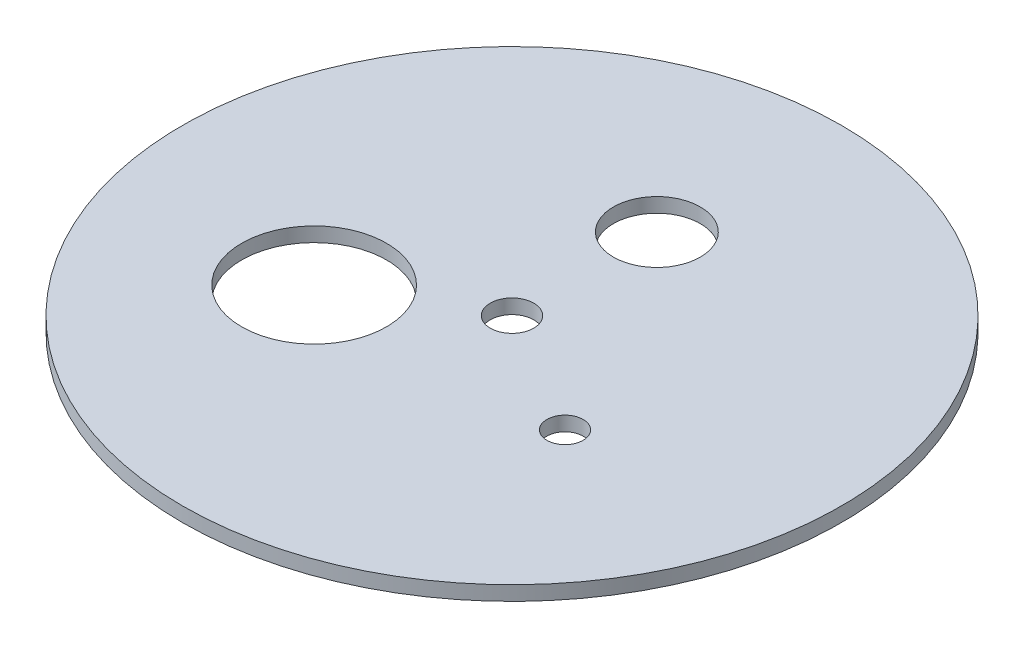
ISO-10303-21;
HEADER;
FILE_DESCRIPTION(('STEP AP214'),'2;1');
FILE_NAME('part.step','',(''),(''),'','','');
FILE_SCHEMA(('AUTOMOTIVE_DESIGN { 1 0 10303 214 1 1 1 1 }'));
ENDSEC;
DATA;
#1=APPLICATION_CONTEXT('core data for automotive mechanical design processes');
#2=APPLICATION_PROTOCOL_DEFINITION('international standard','automotive_design',2000,#1);
#3=PRODUCT_CONTEXT('',#1,'mechanical');
#4=PRODUCT('Part','Part','',(#3));
#5=PRODUCT_RELATED_PRODUCT_CATEGORY('part','',(#4));
#6=PRODUCT_DEFINITION_FORMATION('','',#4);
#7=PRODUCT_DEFINITION_CONTEXT('part definition',#1,'design');
#8=PRODUCT_DEFINITION('design','',#6,#7);
#9=PRODUCT_DEFINITION_SHAPE('','',#8);
#10=(LENGTH_UNIT() NAMED_UNIT(*) SI_UNIT(.MILLI.,.METRE.));
#11=(NAMED_UNIT(*) PLANE_ANGLE_UNIT() SI_UNIT($,.RADIAN.));
#12=(NAMED_UNIT(*) SI_UNIT($,.STERADIAN.) SOLID_ANGLE_UNIT());
#13=UNCERTAINTY_MEASURE_WITH_UNIT(LENGTH_MEASURE(1.E-05),#10,'distance_accuracy_value','');
#14=(GEOMETRIC_REPRESENTATION_CONTEXT(3) GLOBAL_UNCERTAINTY_ASSIGNED_CONTEXT((#13)) GLOBAL_UNIT_ASSIGNED_CONTEXT((#10,
#11,#12)) REPRESENTATION_CONTEXT('',''));
#15=CARTESIAN_POINT('',(0.,0.,0.));
#16=DIRECTION('',(0.,0.,1.));
#17=DIRECTION('',(1.,0.,0.));
#18=AXIS2_PLACEMENT_3D('',#15,#16,#17);
#19=CARTESIAN_POINT('',(0.,2.,0.));
#20=DIRECTION('',(0.,1.,0.));
#21=DIRECTION('',(0.,0.,1.));
#22=AXIS2_PLACEMENT_3D('',#19,#20,#21);
#23=PLANE('',#22);
#24=CARTESIAN_POINT('',(17.3205080756888,2.,10.));
#25=DIRECTION('',(0.,1.,0.));
#26=DIRECTION('',(0.,0.,1.));
#27=AXIS2_PLACEMENT_3D('',#24,#25,#26);
#28=CIRCLE('',#27,2.5);
#29=CARTESIAN_POINT('',(17.3205080756888,2.,12.5));
#30=VERTEX_POINT('',#29);
#31=EDGE_CURVE('E53',#30,#30,#28,.T.);
#32=ORIENTED_EDGE('',*,*,#31,.F.);
#33=EDGE_LOOP('',(#32));
#34=FACE_BOUND('',#33,.T.);
#35=CARTESIAN_POINT('',(0.,2.,-20.));
#36=DIRECTION('',(0.,1.,0.));
#37=DIRECTION('',(0.,0.,1.));
#38=AXIS2_PLACEMENT_3D('',#35,#36,#37);
#39=CIRCLE('',#38,6.);
#40=CARTESIAN_POINT('',(0.,2.,-14.));
#41=VERTEX_POINT('',#40);
#42=EDGE_CURVE('E42',#41,#41,#39,.T.);
#43=ORIENTED_EDGE('',*,*,#42,.F.);
#44=EDGE_LOOP('',(#43));
#45=FACE_BOUND('',#44,.T.);
#46=CARTESIAN_POINT('',(0.,2.,0.));
#47=DIRECTION('',(0.,1.,0.));
#48=DIRECTION('',(0.,0.,1.));
#49=AXIS2_PLACEMENT_3D('',#46,#47,#48);
#50=CIRCLE('',#49,45.5);
#51=CARTESIAN_POINT('',(0.,2.,45.5));
#52=VERTEX_POINT('',#51);
#53=EDGE_CURVE('E10',#52,#52,#50,.T.);
#54=ORIENTED_EDGE('',*,*,#53,.T.);
#55=EDGE_LOOP('',(#54));
#56=FACE_BOUND('',#55,.T.);
#57=CARTESIAN_POINT('',(-17.3205080756888,2.,9.99999999999999));
#58=DIRECTION('',(0.,1.,0.));
#59=DIRECTION('',(0.,0.,1.));
#60=AXIS2_PLACEMENT_3D('',#57,#58,#59);
#61=CIRCLE('',#60,10.);
#62=CARTESIAN_POINT('',(-17.3205080756888,2.,20.));
#63=VERTEX_POINT('',#62);
#64=EDGE_CURVE('E47',#63,#63,#61,.T.);
#65=ORIENTED_EDGE('',*,*,#64,.F.);
#66=EDGE_LOOP('',(#65));
#67=FACE_BOUND('',#66,.T.);
#68=CARTESIAN_POINT('',(0.,2.,0.));
#69=DIRECTION('',(0.,1.,0.));
#70=DIRECTION('',(0.,0.,1.));
#71=AXIS2_PLACEMENT_3D('',#68,#69,#70);
#72=CIRCLE('',#71,3.);
#73=CARTESIAN_POINT('',(0.,2.,3.));
#74=VERTEX_POINT('',#73);
#75=EDGE_CURVE('E59',#74,#74,#72,.T.);
#76=ORIENTED_EDGE('',*,*,#75,.F.);
#77=EDGE_LOOP('',(#76));
#78=FACE_BOUND('',#77,.T.);
#79=ADVANCED_FACE('F31',(#34,#45,#56,#67,#78),#23,.T.);
#80=CARTESIAN_POINT('',(0.,0.,0.));
#81=DIRECTION('',(0.,1.,0.));
#82=DIRECTION('',(0.,0.,1.));
#83=AXIS2_PLACEMENT_3D('',#80,#81,#82);
#84=PLANE('',#83);
#85=CARTESIAN_POINT('',(0.,0.,0.));
#86=DIRECTION('',(0.,1.,0.));
#87=DIRECTION('',(0.,0.,1.));
#88=AXIS2_PLACEMENT_3D('',#85,#86,#87);
#89=CIRCLE('',#88,45.5);
#90=CARTESIAN_POINT('',(0.,0.,45.5));
#91=VERTEX_POINT('',#90);
#92=EDGE_CURVE('E35',#91,#91,#89,.T.);
#93=ORIENTED_EDGE('',*,*,#92,.F.);
#94=EDGE_LOOP('',(#93));
#95=FACE_BOUND('',#94,.T.);
#96=CARTESIAN_POINT('',(0.,0.,-20.));
#97=DIRECTION('',(0.,1.,0.));
#98=DIRECTION('',(0.,0.,1.));
#99=AXIS2_PLACEMENT_3D('',#96,#97,#98);
#100=CIRCLE('',#99,6.);
#101=CARTESIAN_POINT('',(0.,0.,-14.));
#102=VERTEX_POINT('',#101);
#103=EDGE_CURVE('E44',#102,#102,#100,.T.);
#104=ORIENTED_EDGE('',*,*,#103,.T.);
#105=EDGE_LOOP('',(#104));
#106=FACE_BOUND('',#105,.T.);
#107=CARTESIAN_POINT('',(-17.3205080756888,0.,9.99999999999999));
#108=DIRECTION('',(0.,1.,0.));
#109=DIRECTION('',(0.,0.,1.));
#110=AXIS2_PLACEMENT_3D('',#107,#108,#109);
#111=CIRCLE('',#110,10.);
#112=CARTESIAN_POINT('',(-17.3205080756888,0.,20.));
#113=VERTEX_POINT('',#112);
#114=EDGE_CURVE('E50',#113,#113,#111,.T.);
#115=ORIENTED_EDGE('',*,*,#114,.T.);
#116=EDGE_LOOP('',(#115));
#117=FACE_BOUND('',#116,.T.);
#118=CARTESIAN_POINT('',(17.3205080756888,0.,10.));
#119=DIRECTION('',(0.,1.,0.));
#120=DIRECTION('',(0.,0.,1.));
#121=AXIS2_PLACEMENT_3D('',#118,#119,#120);
#122=CIRCLE('',#121,2.5);
#123=CARTESIAN_POINT('',(17.3205080756888,0.,12.5));
#124=VERTEX_POINT('',#123);
#125=EDGE_CURVE('E56',#124,#124,#122,.T.);
#126=ORIENTED_EDGE('',*,*,#125,.T.);
#127=EDGE_LOOP('',(#126));
#128=FACE_BOUND('',#127,.T.);
#129=CARTESIAN_POINT('',(0.,0.,0.));
#130=DIRECTION('',(0.,1.,0.));
#131=DIRECTION('',(0.,0.,1.));
#132=AXIS2_PLACEMENT_3D('',#129,#130,#131);
#133=CIRCLE('',#132,3.);
#134=CARTESIAN_POINT('',(0.,0.,3.));
#135=VERTEX_POINT('',#134);
#136=EDGE_CURVE('E62',#135,#135,#133,.T.);
#137=ORIENTED_EDGE('',*,*,#136,.T.);
#138=EDGE_LOOP('',(#137));
#139=FACE_BOUND('',#138,.T.);
#140=ADVANCED_FACE('F72',(#95,#106,#117,#128,#139),#84,.F.);
#141=CARTESIAN_POINT('',(0.,2.,0.));
#142=DIRECTION('',(0.,-1.,0.));
#143=DIRECTION('',(0.,0.,-1.));
#144=AXIS2_PLACEMENT_3D('',#141,#142,#143);
#145=CYLINDRICAL_SURFACE('',#144,45.5);
#146=ORIENTED_EDGE('',*,*,#53,.F.);
#147=EDGE_LOOP('',(#146));
#148=FACE_BOUND('',#147,.T.);
#149=ORIENTED_EDGE('',*,*,#92,.T.);
#150=EDGE_LOOP('',(#149));
#151=FACE_BOUND('',#150,.T.);
#152=ADVANCED_FACE('F33',(#148,#151),#145,.T.);
#153=CARTESIAN_POINT('',(0.,2.,-20.));
#154=DIRECTION('',(0.,-1.,0.));
#155=DIRECTION('',(0.,0.,-1.));
#156=AXIS2_PLACEMENT_3D('',#153,#154,#155);
#157=CYLINDRICAL_SURFACE('',#156,6.);
#158=ORIENTED_EDGE('',*,*,#42,.T.);
#159=EDGE_LOOP('',(#158));
#160=FACE_BOUND('',#159,.T.);
#161=ORIENTED_EDGE('',*,*,#103,.F.);
#162=EDGE_LOOP('',(#161));
#163=FACE_BOUND('',#162,.T.);
#164=ADVANCED_FACE('F82',(#160,#163),#157,.F.);
#165=CARTESIAN_POINT('',(-17.3205080756888,2.,9.99999999999999));
#166=DIRECTION('',(0.,-1.,0.));
#167=DIRECTION('',(0.,0.,-1.));
#168=AXIS2_PLACEMENT_3D('',#165,#166,#167);
#169=CYLINDRICAL_SURFACE('',#168,10.);
#170=ORIENTED_EDGE('',*,*,#64,.T.);
#171=EDGE_LOOP('',(#170));
#172=FACE_BOUND('',#171,.T.);
#173=ORIENTED_EDGE('',*,*,#114,.F.);
#174=EDGE_LOOP('',(#173));
#175=FACE_BOUND('',#174,.T.);
#176=ADVANCED_FACE('F85',(#172,#175),#169,.F.);
#177=CARTESIAN_POINT('',(17.3205080756888,2.,10.));
#178=DIRECTION('',(0.,-1.,0.));
#179=DIRECTION('',(0.,0.,-1.));
#180=AXIS2_PLACEMENT_3D('',#177,#178,#179);
#181=CYLINDRICAL_SURFACE('',#180,2.5);
#182=ORIENTED_EDGE('',*,*,#31,.T.);
#183=EDGE_LOOP('',(#182));
#184=FACE_BOUND('',#183,.T.);
#185=ORIENTED_EDGE('',*,*,#125,.F.);
#186=EDGE_LOOP('',(#185));
#187=FACE_BOUND('',#186,.T.);
#188=ADVANCED_FACE('F89',(#184,#187),#181,.F.);
#189=CARTESIAN_POINT('',(0.,2.,0.));
#190=DIRECTION('',(0.,-1.,0.));
#191=DIRECTION('',(0.,0.,-1.));
#192=AXIS2_PLACEMENT_3D('',#189,#190,#191);
#193=CYLINDRICAL_SURFACE('',#192,3.);
#194=ORIENTED_EDGE('',*,*,#75,.T.);
#195=EDGE_LOOP('',(#194));
#196=FACE_BOUND('',#195,.T.);
#197=ORIENTED_EDGE('',*,*,#136,.F.);
#198=EDGE_LOOP('',(#197));
#199=FACE_BOUND('',#198,.T.);
#200=ADVANCED_FACE('F68',(#196,#199),#193,.F.);
#201=CLOSED_SHELL('',(#79,#140,#152,#164,#176,#188,#200));
#202=MANIFOLD_SOLID_BREP('B2',#201);
#203=ADVANCED_BREP_SHAPE_REPRESENTATION('',(#18,#202),#14);
#204=SHAPE_DEFINITION_REPRESENTATION(#9,#203);
ENDSEC;
END-ISO-10303-21;
